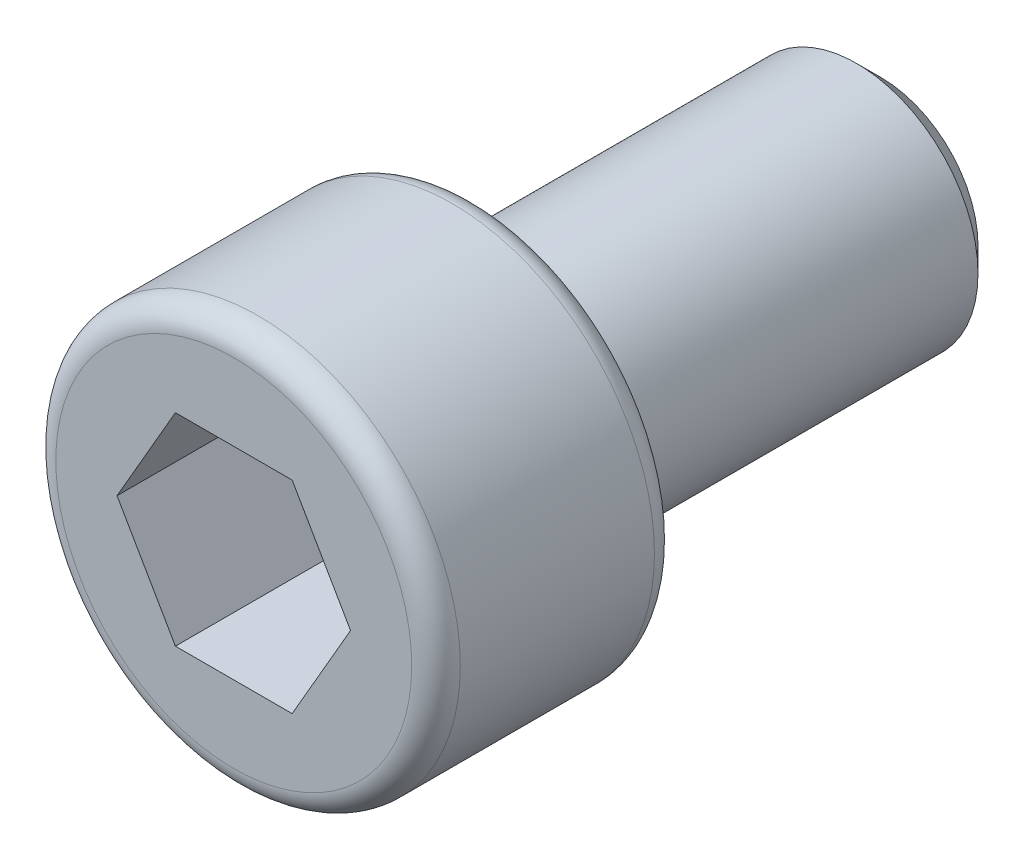
ISO-10303-21;
HEADER;
FILE_DESCRIPTION(('STEP AP214'),'2;1');
FILE_NAME('part.step','',(''),(''),'','','');
FILE_SCHEMA(('AUTOMOTIVE_DESIGN { 1 0 10303 214 1 1 1 1 }'));
ENDSEC;
DATA;
#1=APPLICATION_CONTEXT('core data for automotive mechanical design processes');
#2=APPLICATION_PROTOCOL_DEFINITION('international standard','automotive_design',2000,#1);
#3=PRODUCT_CONTEXT('',#1,'mechanical');
#4=PRODUCT('Part','Part','',(#3));
#5=PRODUCT_RELATED_PRODUCT_CATEGORY('part','',(#4));
#6=PRODUCT_DEFINITION_FORMATION('','',#4);
#7=PRODUCT_DEFINITION_CONTEXT('part definition',#1,'design');
#8=PRODUCT_DEFINITION('design','',#6,#7);
#9=PRODUCT_DEFINITION_SHAPE('','',#8);
#10=(LENGTH_UNIT() NAMED_UNIT(*) SI_UNIT(.MILLI.,.METRE.));
#11=(NAMED_UNIT(*) PLANE_ANGLE_UNIT() SI_UNIT($,.RADIAN.));
#12=(NAMED_UNIT(*) SI_UNIT($,.STERADIAN.) SOLID_ANGLE_UNIT());
#13=UNCERTAINTY_MEASURE_WITH_UNIT(LENGTH_MEASURE(1.E-05),#10,'distance_accuracy_value','');
#14=(GEOMETRIC_REPRESENTATION_CONTEXT(3) GLOBAL_UNCERTAINTY_ASSIGNED_CONTEXT((#13)) GLOBAL_UNIT_ASSIGNED_CONTEXT((#10,
#11,#12)) REPRESENTATION_CONTEXT('',''));
#15=CARTESIAN_POINT('',(0.,0.,0.));
#16=DIRECTION('',(0.,0.,1.));
#17=DIRECTION('',(1.,0.,0.));
#18=AXIS2_PLACEMENT_3D('',#15,#16,#17);
#19=CARTESIAN_POINT('',(0.,0.,3.));
#20=DIRECTION('',(0.,0.,-1.));
#21=DIRECTION('',(-1.,0.,0.));
#22=AXIS2_PLACEMENT_3D('',#19,#20,#21);
#23=CYLINDRICAL_SURFACE('',#22,2.5);
#24=CARTESIAN_POINT('',(0.,0.,0.3));
#25=DIRECTION('',(0.,0.,1.));
#26=DIRECTION('',(1.,0.,0.));
#27=AXIS2_PLACEMENT_3D('',#24,#25,#26);
#28=CIRCLE('',#27,2.5);
#29=CARTESIAN_POINT('',(2.5,0.,0.3));
#30=VERTEX_POINT('',#29);
#31=EDGE_CURVE('E154',#30,#30,#28,.T.);
#32=ORIENTED_EDGE('',*,*,#31,.T.);
#33=EDGE_LOOP('',(#32));
#34=FACE_BOUND('',#33,.T.);
#35=CARTESIAN_POINT('',(0.,0.,2.7));
#36=DIRECTION('',(0.,0.,1.));
#37=DIRECTION('',(1.,0.,0.));
#38=AXIS2_PLACEMENT_3D('',#35,#36,#37);
#39=CIRCLE('',#38,2.5);
#40=CARTESIAN_POINT('',(2.5,0.,2.7));
#41=VERTEX_POINT('',#40);
#42=EDGE_CURVE('E151',#41,#41,#39,.F.);
#43=ORIENTED_EDGE('',*,*,#42,.T.);
#44=EDGE_LOOP('',(#43));
#45=FACE_BOUND('',#44,.T.);
#46=ADVANCED_FACE('F35',(#34,#45),#23,.T.);
#47=CARTESIAN_POINT('',(0.,0.,3.));
#48=DIRECTION('',(0.,0.,1.));
#49=DIRECTION('',(1.,0.,0.));
#50=AXIS2_PLACEMENT_3D('',#47,#48,#49);
#51=PLANE('',#50);
#52=CARTESIAN_POINT('',(0.,0.,3.));
#53=DIRECTION('',(0.,0.,1.));
#54=DIRECTION('',(1.,0.,0.));
#55=AXIS2_PLACEMENT_3D('',#52,#53,#54);
#56=CIRCLE('',#55,2.2);
#57=CARTESIAN_POINT('',(2.2,0.,3.));
#58=VERTEX_POINT('',#57);
#59=EDGE_CURVE('E11',#58,#58,#56,.T.);
#60=ORIENTED_EDGE('',*,*,#59,.T.);
#61=EDGE_LOOP('',(#60));
#62=FACE_BOUND('',#61,.T.);
#63=DIRECTION('',(0.5,0.866025403784439,0.));
#64=VECTOR('',#63,1.);
#65=CARTESIAN_POINT('',(0.721687836487033,-1.25,3.));
#66=LINE('',#65,#64);
#67=CARTESIAN_POINT('',(0.721687836487033,-1.25,3.));
#68=VERTEX_POINT('',#67);
#69=CARTESIAN_POINT('',(1.44337567297406,0.,3.));
#70=VERTEX_POINT('',#69);
#71=EDGE_CURVE('E50',#68,#70,#66,.T.);
#72=ORIENTED_EDGE('',*,*,#71,.F.);
#73=DIRECTION('',(1.,0.,0.));
#74=VECTOR('',#73,1.);
#75=CARTESIAN_POINT('',(-0.721687836487032,-1.25,3.));
#76=LINE('',#75,#74);
#77=CARTESIAN_POINT('',(-0.721687836487032,-1.25,3.));
#78=VERTEX_POINT('',#77);
#79=EDGE_CURVE('E133',#78,#68,#76,.T.);
#80=ORIENTED_EDGE('',*,*,#79,.F.);
#81=DIRECTION('',(0.5,-0.866025403784438,0.));
#82=VECTOR('',#81,1.);
#83=CARTESIAN_POINT('',(-1.44337567297406,0.,3.));
#84=LINE('',#83,#82);
#85=CARTESIAN_POINT('',(-1.44337567297406,0.,3.));
#86=VERTEX_POINT('',#85);
#87=EDGE_CURVE('E131',#86,#78,#84,.T.);
#88=ORIENTED_EDGE('',*,*,#87,.F.);
#89=DIRECTION('',(-0.5,-0.866025403784439,0.));
#90=VECTOR('',#89,1.);
#91=CARTESIAN_POINT('',(-0.721687836487032,1.25,3.));
#92=LINE('',#91,#90);
#93=CARTESIAN_POINT('',(-0.721687836487032,1.25,3.));
#94=VERTEX_POINT('',#93);
#95=EDGE_CURVE('E98',#94,#86,#92,.T.);
#96=ORIENTED_EDGE('',*,*,#95,.F.);
#97=DIRECTION('',(-1.,0.,0.));
#98=VECTOR('',#97,1.);
#99=CARTESIAN_POINT('',(0.721687836487032,1.25,3.));
#100=LINE('',#99,#98);
#101=CARTESIAN_POINT('',(0.721687836487032,1.25,3.));
#102=VERTEX_POINT('',#101);
#103=EDGE_CURVE('E127',#102,#94,#100,.T.);
#104=ORIENTED_EDGE('',*,*,#103,.F.);
#105=DIRECTION('',(-0.5,0.866025403784439,0.));
#106=VECTOR('',#105,1.);
#107=CARTESIAN_POINT('',(1.44337567297406,0.,3.));
#108=LINE('',#107,#106);
#109=EDGE_CURVE('E124',#70,#102,#108,.T.);
#110=ORIENTED_EDGE('',*,*,#109,.F.);
#111=EDGE_LOOP('',(#72,#80,#88,#96,#104,#110));
#112=FACE_BOUND('',#111,.T.);
#113=ADVANCED_FACE('F170',(#62,#112),#51,.T.);
#114=CARTESIAN_POINT('',(0.,0.,0.));
#115=DIRECTION('',(0.,0.,1.));
#116=DIRECTION('',(1.,0.,0.));
#117=AXIS2_PLACEMENT_3D('',#114,#115,#116);
#118=PLANE('',#117);
#119=CARTESIAN_POINT('',(0.,0.,0.));
#120=DIRECTION('',(0.,0.,1.));
#121=DIRECTION('',(1.,0.,0.));
#122=AXIS2_PLACEMENT_3D('',#119,#120,#121);
#123=CIRCLE('',#122,2.2);
#124=CARTESIAN_POINT('',(2.2,0.,0.));
#125=VERTEX_POINT('',#124);
#126=EDGE_CURVE('E43',#125,#125,#123,.F.);
#127=ORIENTED_EDGE('',*,*,#126,.T.);
#128=EDGE_LOOP('',(#127));
#129=FACE_BOUND('',#128,.T.);
#130=CARTESIAN_POINT('',(0.,0.,0.));
#131=DIRECTION('',(0.,0.,-1.));
#132=DIRECTION('',(-1.,0.,0.));
#133=AXIS2_PLACEMENT_3D('',#130,#131,#132);
#134=CIRCLE('',#133,1.5);
#135=CARTESIAN_POINT('',(-1.5,0.,0.));
#136=VERTEX_POINT('',#135);
#137=EDGE_CURVE('E137',#136,#136,#134,.T.);
#138=ORIENTED_EDGE('',*,*,#137,.F.);
#139=EDGE_LOOP('',(#138));
#140=FACE_BOUND('',#139,.T.);
#141=ADVANCED_FACE('F159',(#129,#140),#118,.F.);
#142=CARTESIAN_POINT('',(0.,0.,-5.));
#143=DIRECTION('',(0.,0.,1.));
#144=DIRECTION('',(1.,0.,0.));
#145=AXIS2_PLACEMENT_3D('',#142,#143,#144);
#146=CYLINDRICAL_SURFACE('',#145,1.5);
#147=CARTESIAN_POINT('',(0.,0.,-4.7));
#148=DIRECTION('',(0.,0.,-1.));
#149=DIRECTION('',(-1.,0.,0.));
#150=AXIS2_PLACEMENT_3D('',#147,#148,#149);
#151=CIRCLE('',#150,1.5);
#152=CARTESIAN_POINT('',(-1.5,0.,-4.7));
#153=VERTEX_POINT('',#152);
#154=EDGE_CURVE('E148',#153,#153,#151,.F.);
#155=ORIENTED_EDGE('',*,*,#154,.T.);
#156=EDGE_LOOP('',(#155));
#157=FACE_BOUND('',#156,.T.);
#158=ORIENTED_EDGE('',*,*,#137,.T.);
#159=EDGE_LOOP('',(#158));
#160=FACE_BOUND('',#159,.T.);
#161=ADVANCED_FACE('F197',(#157,#160),#146,.T.);
#162=CARTESIAN_POINT('',(0.,0.,-5.));
#163=DIRECTION('',(0.,0.,-1.));
#164=DIRECTION('',(-1.,0.,0.));
#165=AXIS2_PLACEMENT_3D('',#162,#163,#164);
#166=PLANE('',#165);
#167=CARTESIAN_POINT('',(0.,0.,-5.));
#168=DIRECTION('',(0.,0.,-1.));
#169=DIRECTION('',(-1.,0.,0.));
#170=AXIS2_PLACEMENT_3D('',#167,#168,#169);
#171=CIRCLE('',#170,1.2);
#172=CARTESIAN_POINT('',(-1.2,0.,-5.));
#173=VERTEX_POINT('',#172);
#174=EDGE_CURVE('E145',#173,#173,#171,.T.);
#175=ORIENTED_EDGE('',*,*,#174,.T.);
#176=EDGE_LOOP('',(#175));
#177=FACE_BOUND('',#176,.T.);
#178=ADVANCED_FACE('F190',(#177),#166,.T.);
#179=CARTESIAN_POINT('',(0.721687836487033,-1.25,1.));
#180=DIRECTION('',(0.866025403784439,-0.5,0.));
#181=DIRECTION('',(0.5,0.866025403784439,0.));
#182=AXIS2_PLACEMENT_3D('',#179,#180,#181);
#183=PLANE('',#182);
#184=ORIENTED_EDGE('',*,*,#71,.T.);
#185=DIRECTION('',(0.,0.,1.));
#186=VECTOR('',#185,1.);
#187=CARTESIAN_POINT('',(1.44337567297406,0.,1.));
#188=LINE('',#187,#186);
#189=CARTESIAN_POINT('',(1.44337567297406,0.,1.));
#190=VERTEX_POINT('',#189);
#191=EDGE_CURVE('E80',#190,#70,#188,.T.);
#192=ORIENTED_EDGE('',*,*,#191,.F.);
#193=DIRECTION('',(0.5,0.866025403784439,0.));
#194=VECTOR('',#193,1.);
#195=CARTESIAN_POINT('',(0.721687836487033,-1.25,1.));
#196=LINE('',#195,#194);
#197=CARTESIAN_POINT('',(0.721687836487033,-1.25,1.));
#198=VERTEX_POINT('',#197);
#199=EDGE_CURVE('E135',#198,#190,#196,.T.);
#200=ORIENTED_EDGE('',*,*,#199,.F.);
#201=DIRECTION('',(0.,0.,1.));
#202=VECTOR('',#201,1.);
#203=CARTESIAN_POINT('',(0.721687836487033,-1.25,1.));
#204=LINE('',#203,#202);
#205=EDGE_CURVE('E58',#198,#68,#204,.T.);
#206=ORIENTED_EDGE('',*,*,#205,.T.);
#207=EDGE_LOOP('',(#184,#192,#200,#206));
#208=FACE_BOUND('',#207,.T.);
#209=ADVANCED_FACE('F187',(#208),#183,.F.);
#210=CARTESIAN_POINT('',(-0.721687836487032,-1.25,1.));
#211=DIRECTION('',(0.,-1.,0.));
#212=DIRECTION('',(0.,0.,-1.));
#213=AXIS2_PLACEMENT_3D('',#210,#211,#212);
#214=PLANE('',#213);
#215=ORIENTED_EDGE('',*,*,#79,.T.);
#216=ORIENTED_EDGE('',*,*,#205,.F.);
#217=DIRECTION('',(1.,0.,0.));
#218=VECTOR('',#217,1.);
#219=CARTESIAN_POINT('',(-0.721687836487032,-1.25,1.));
#220=LINE('',#219,#218);
#221=CARTESIAN_POINT('',(-0.721687836487032,-1.25,1.));
#222=VERTEX_POINT('',#221);
#223=EDGE_CURVE('E110',#222,#198,#220,.T.);
#224=ORIENTED_EDGE('',*,*,#223,.F.);
#225=DIRECTION('',(0.,0.,1.));
#226=VECTOR('',#225,1.);
#227=CARTESIAN_POINT('',(-0.721687836487032,-1.25,1.));
#228=LINE('',#227,#226);
#229=EDGE_CURVE('E102',#222,#78,#228,.T.);
#230=ORIENTED_EDGE('',*,*,#229,.T.);
#231=EDGE_LOOP('',(#215,#216,#224,#230));
#232=FACE_BOUND('',#231,.T.);
#233=ADVANCED_FACE('F189',(#232),#214,.F.);
#234=CARTESIAN_POINT('',(-1.44337567297406,0.,1.));
#235=DIRECTION('',(-0.866025403784438,-0.5,0.));
#236=DIRECTION('',(0.5,-0.866025403784438,0.));
#237=AXIS2_PLACEMENT_3D('',#234,#235,#236);
#238=PLANE('',#237);
#239=ORIENTED_EDGE('',*,*,#87,.T.);
#240=ORIENTED_EDGE('',*,*,#229,.F.);
#241=DIRECTION('',(0.5,-0.866025403784438,0.));
#242=VECTOR('',#241,1.);
#243=CARTESIAN_POINT('',(-1.44337567297406,0.,1.));
#244=LINE('',#243,#242);
#245=CARTESIAN_POINT('',(-1.44337567297406,0.,1.));
#246=VERTEX_POINT('',#245);
#247=EDGE_CURVE('E106',#246,#222,#244,.T.);
#248=ORIENTED_EDGE('',*,*,#247,.F.);
#249=DIRECTION('',(0.,0.,1.));
#250=VECTOR('',#249,1.);
#251=CARTESIAN_POINT('',(-1.44337567297406,0.,1.));
#252=LINE('',#251,#250);
#253=EDGE_CURVE('E91',#246,#86,#252,.T.);
#254=ORIENTED_EDGE('',*,*,#253,.T.);
#255=EDGE_LOOP('',(#239,#240,#248,#254));
#256=FACE_BOUND('',#255,.T.);
#257=ADVANCED_FACE('F107',(#256),#238,.F.);
#258=CARTESIAN_POINT('',(-0.721687836487032,1.25,1.));
#259=DIRECTION('',(-0.866025403784439,0.5,0.));
#260=DIRECTION('',(-0.5,-0.866025403784439,0.));
#261=AXIS2_PLACEMENT_3D('',#258,#259,#260);
#262=PLANE('',#261);
#263=ORIENTED_EDGE('',*,*,#95,.T.);
#264=ORIENTED_EDGE('',*,*,#253,.F.);
#265=DIRECTION('',(-0.5,-0.866025403784439,0.));
#266=VECTOR('',#265,1.);
#267=CARTESIAN_POINT('',(-0.721687836487032,1.25,1.));
#268=LINE('',#267,#266);
#269=CARTESIAN_POINT('',(-0.721687836487032,1.25,1.));
#270=VERTEX_POINT('',#269);
#271=EDGE_CURVE('E95',#270,#246,#268,.T.);
#272=ORIENTED_EDGE('',*,*,#271,.F.);
#273=DIRECTION('',(0.,0.,1.));
#274=VECTOR('',#273,1.);
#275=CARTESIAN_POINT('',(-0.721687836487032,1.25,1.));
#276=LINE('',#275,#274);
#277=EDGE_CURVE('E103',#270,#94,#276,.T.);
#278=ORIENTED_EDGE('',*,*,#277,.T.);
#279=EDGE_LOOP('',(#263,#264,#272,#278));
#280=FACE_BOUND('',#279,.T.);
#281=ADVANCED_FACE('F93',(#280),#262,.F.);
#282=CARTESIAN_POINT('',(0.721687836487032,1.25,1.));
#283=DIRECTION('',(0.,1.,0.));
#284=DIRECTION('',(0.,0.,1.));
#285=AXIS2_PLACEMENT_3D('',#282,#283,#284);
#286=PLANE('',#285);
#287=ORIENTED_EDGE('',*,*,#103,.T.);
#288=ORIENTED_EDGE('',*,*,#277,.F.);
#289=DIRECTION('',(-1.,0.,0.));
#290=VECTOR('',#289,1.);
#291=CARTESIAN_POINT('',(0.721687836487032,1.25,1.));
#292=LINE('',#291,#290);
#293=CARTESIAN_POINT('',(0.721687836487032,1.25,1.));
#294=VERTEX_POINT('',#293);
#295=EDGE_CURVE('E116',#294,#270,#292,.T.);
#296=ORIENTED_EDGE('',*,*,#295,.F.);
#297=DIRECTION('',(0.,0.,1.));
#298=VECTOR('',#297,1.);
#299=CARTESIAN_POINT('',(0.721687836487032,1.25,1.));
#300=LINE('',#299,#298);
#301=EDGE_CURVE('E140',#294,#102,#300,.T.);
#302=ORIENTED_EDGE('',*,*,#301,.T.);
#303=EDGE_LOOP('',(#287,#288,#296,#302));
#304=FACE_BOUND('',#303,.T.);
#305=ADVANCED_FACE('F225',(#304),#286,.F.);
#306=CARTESIAN_POINT('',(1.44337567297406,0.,1.));
#307=DIRECTION('',(0.866025403784438,0.5,0.));
#308=DIRECTION('',(-0.5,0.866025403784439,0.));
#309=AXIS2_PLACEMENT_3D('',#306,#307,#308);
#310=PLANE('',#309);
#311=ORIENTED_EDGE('',*,*,#109,.T.);
#312=ORIENTED_EDGE('',*,*,#301,.F.);
#313=DIRECTION('',(-0.5,0.866025403784439,0.));
#314=VECTOR('',#313,1.);
#315=CARTESIAN_POINT('',(1.44337567297406,0.,1.));
#316=LINE('',#315,#314);
#317=EDGE_CURVE('E118',#190,#294,#316,.T.);
#318=ORIENTED_EDGE('',*,*,#317,.F.);
#319=ORIENTED_EDGE('',*,*,#191,.T.);
#320=EDGE_LOOP('',(#311,#312,#318,#319));
#321=FACE_BOUND('',#320,.T.);
#322=ADVANCED_FACE('F185',(#321),#310,.F.);
#323=CARTESIAN_POINT('',(0.,0.,1.));
#324=DIRECTION('',(0.,0.,1.));
#325=DIRECTION('',(1.,0.,0.));
#326=AXIS2_PLACEMENT_3D('',#323,#324,#325);
#327=PLANE('',#326);
#328=ORIENTED_EDGE('',*,*,#199,.T.);
#329=ORIENTED_EDGE('',*,*,#317,.T.);
#330=ORIENTED_EDGE('',*,*,#295,.T.);
#331=ORIENTED_EDGE('',*,*,#271,.T.);
#332=ORIENTED_EDGE('',*,*,#247,.T.);
#333=ORIENTED_EDGE('',*,*,#223,.T.);
#334=EDGE_LOOP('',(#328,#329,#330,#331,#332,#333));
#335=FACE_BOUND('',#334,.T.);
#336=ADVANCED_FACE('F113',(#335),#327,.T.);
#337=CARTESIAN_POINT('',(0.,0.,-5.));
#338=DIRECTION('',(0.,0.,1.));
#339=DIRECTION('',(1.,0.,0.));
#340=AXIS2_PLACEMENT_3D('',#337,#338,#339);
#341=CONICAL_SURFACE('',#340,1.2,0.785398163397447);
#342=ORIENTED_EDGE('',*,*,#154,.F.);
#343=EDGE_LOOP('',(#342));
#344=FACE_BOUND('',#343,.T.);
#345=ORIENTED_EDGE('',*,*,#174,.F.);
#346=EDGE_LOOP('',(#345));
#347=FACE_BOUND('',#346,.T.);
#348=ADVANCED_FACE('F165',(#344,#347),#341,.T.);
#349=CARTESIAN_POINT('',(0.,0.,0.3));
#350=DIRECTION('',(0.,0.,1.));
#351=DIRECTION('',(1.,0.,0.));
#352=AXIS2_PLACEMENT_3D('',#349,#350,#351);
#353=TOROIDAL_SURFACE('',#352,2.2,0.3);
#354=ORIENTED_EDGE('',*,*,#126,.F.);
#355=EDGE_LOOP('',(#354));
#356=FACE_BOUND('',#355,.T.);
#357=ORIENTED_EDGE('',*,*,#31,.F.);
#358=EDGE_LOOP('',(#357));
#359=FACE_BOUND('',#358,.T.);
#360=ADVANCED_FACE('F162',(#356,#359),#353,.T.);
#361=CARTESIAN_POINT('',(0.,0.,2.7));
#362=DIRECTION('',(0.,0.,1.));
#363=DIRECTION('',(1.,0.,0.));
#364=AXIS2_PLACEMENT_3D('',#361,#362,#363);
#365=TOROIDAL_SURFACE('',#364,2.2,0.3);
#366=ORIENTED_EDGE('',*,*,#42,.F.);
#367=EDGE_LOOP('',(#366));
#368=FACE_BOUND('',#367,.T.);
#369=ORIENTED_EDGE('',*,*,#59,.F.);
#370=EDGE_LOOP('',(#369));
#371=FACE_BOUND('',#370,.T.);
#372=ADVANCED_FACE('F37',(#368,#371),#365,.T.);
#373=CLOSED_SHELL('',(#46,#113,#141,#161,#178,#209,#233,#257,#281,#305,#322,#336,#348,#360,#372));
#374=MANIFOLD_SOLID_BREP('B2',#373);
#375=ADVANCED_BREP_SHAPE_REPRESENTATION('',(#18,#374),#14);
#376=SHAPE_DEFINITION_REPRESENTATION(#9,#375);
ENDSEC;
END-ISO-10303-21;
